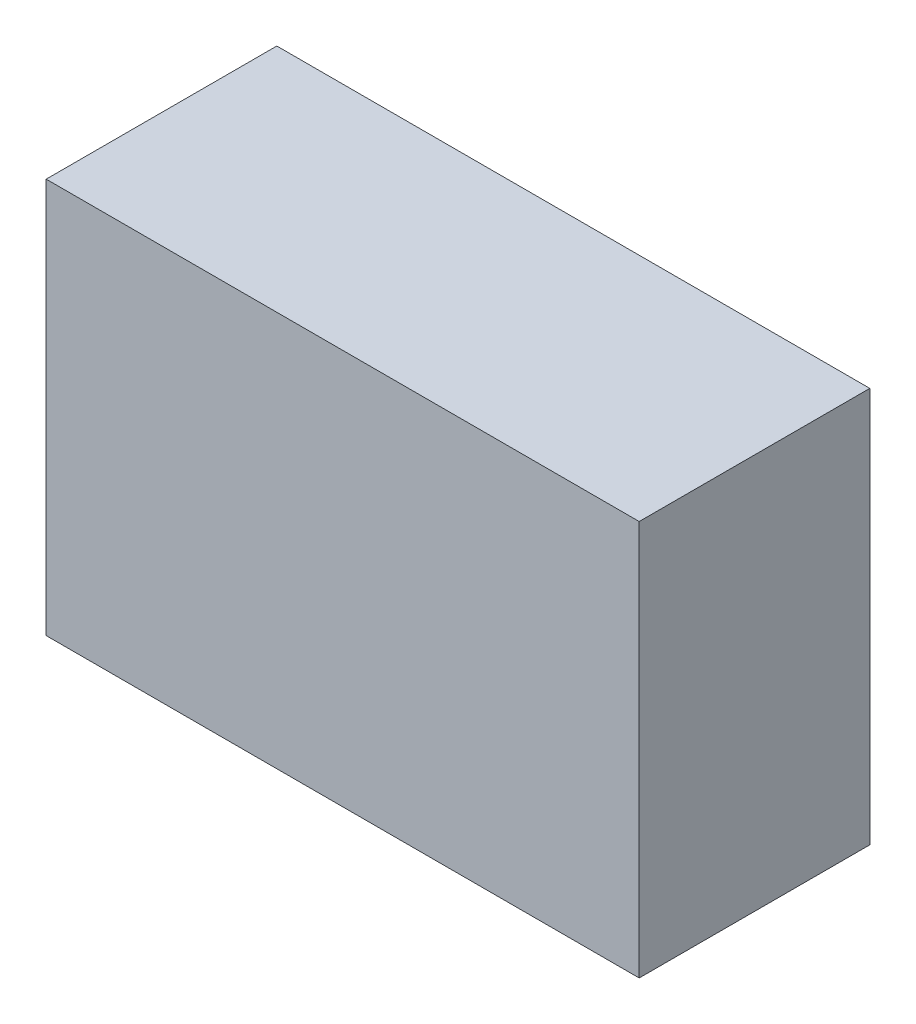
ISO-10303-21;
HEADER;
FILE_DESCRIPTION(('STEP AP214'),'2;1');
FILE_NAME('part.step','',(''),(''),'','','');
FILE_SCHEMA(('AUTOMOTIVE_DESIGN { 1 0 10303 214 1 1 1 1 }'));
ENDSEC;
DATA;
#1=APPLICATION_CONTEXT('core data for automotive mechanical design processes');
#2=APPLICATION_PROTOCOL_DEFINITION('international standard','automotive_design',2000,#1);
#3=PRODUCT_CONTEXT('',#1,'mechanical');
#4=PRODUCT('Part','Part','',(#3));
#5=PRODUCT_RELATED_PRODUCT_CATEGORY('part','',(#4));
#6=PRODUCT_DEFINITION_FORMATION('','',#4);
#7=PRODUCT_DEFINITION_CONTEXT('part definition',#1,'design');
#8=PRODUCT_DEFINITION('design','',#6,#7);
#9=PRODUCT_DEFINITION_SHAPE('','',#8);
#10=(LENGTH_UNIT() NAMED_UNIT(*) SI_UNIT(.MILLI.,.METRE.));
#11=(NAMED_UNIT(*) PLANE_ANGLE_UNIT() SI_UNIT($,.RADIAN.));
#12=(NAMED_UNIT(*) SI_UNIT($,.STERADIAN.) SOLID_ANGLE_UNIT());
#13=UNCERTAINTY_MEASURE_WITH_UNIT(LENGTH_MEASURE(1.E-05),#10,'distance_accuracy_value','');
#14=(GEOMETRIC_REPRESENTATION_CONTEXT(3) GLOBAL_UNCERTAINTY_ASSIGNED_CONTEXT((#13)) GLOBAL_UNIT_ASSIGNED_CONTEXT((#10,
#11,#12)) REPRESENTATION_CONTEXT('',''));
#15=CARTESIAN_POINT('',(0.,0.,0.));
#16=DIRECTION('',(0.,0.,1.));
#17=DIRECTION('',(1.,0.,0.));
#18=AXIS2_PLACEMENT_3D('',#15,#16,#17);
#19=CARTESIAN_POINT('',(0.,0.,14.));
#20=DIRECTION('',(0.,0.,1.));
#21=DIRECTION('',(1.,0.,0.));
#22=AXIS2_PLACEMENT_3D('',#19,#20,#21);
#23=PLANE('',#22);
#24=DIRECTION('',(-1.,0.,0.));
#25=VECTOR('',#24,1.);
#26=CARTESIAN_POINT('',(0.,-12.,14.));
#27=LINE('',#26,#25);
#28=CARTESIAN_POINT('',(18.,-12.,14.));
#29=VERTEX_POINT('',#28);
#30=CARTESIAN_POINT('',(-18.,-12.,14.));
#31=VERTEX_POINT('',#30);
#32=EDGE_CURVE('E11',#29,#31,#27,.T.);
#33=ORIENTED_EDGE('',*,*,#32,.F.);
#34=DIRECTION('',(0.,-1.,0.));
#35=VECTOR('',#34,1.);
#36=CARTESIAN_POINT('',(18.,0.,14.));
#37=LINE('',#36,#35);
#38=CARTESIAN_POINT('',(18.,12.,14.));
#39=VERTEX_POINT('',#38);
#40=EDGE_CURVE('E61',#39,#29,#37,.T.);
#41=ORIENTED_EDGE('',*,*,#40,.F.);
#42=DIRECTION('',(1.,0.,0.));
#43=VECTOR('',#42,1.);
#44=CARTESIAN_POINT('',(0.,12.,14.));
#45=LINE('',#44,#43);
#46=CARTESIAN_POINT('',(-18.,12.,14.));
#47=VERTEX_POINT('',#46);
#48=EDGE_CURVE('E87',#47,#39,#45,.T.);
#49=ORIENTED_EDGE('',*,*,#48,.F.);
#50=DIRECTION('',(0.,1.,0.));
#51=VECTOR('',#50,1.);
#52=CARTESIAN_POINT('',(-18.,0.,14.));
#53=LINE('',#52,#51);
#54=EDGE_CURVE('E24',#31,#47,#53,.T.);
#55=ORIENTED_EDGE('',*,*,#54,.F.);
#56=EDGE_LOOP('',(#33,#41,#49,#55));
#57=FACE_BOUND('',#56,.T.);
#58=ADVANCED_FACE('F17',(#57),#23,.T.);
#59=CARTESIAN_POINT('',(0.,-12.,0.));
#60=DIRECTION('',(0.,-1.,0.));
#61=DIRECTION('',(0.,0.,-1.));
#62=AXIS2_PLACEMENT_3D('',#59,#60,#61);
#63=PLANE('',#62);
#64=DIRECTION('',(0.,0.,1.));
#65=VECTOR('',#64,1.);
#66=CARTESIAN_POINT('',(18.,-12.,0.));
#67=LINE('',#66,#65);
#68=CARTESIAN_POINT('',(18.,-12.,0.));
#69=VERTEX_POINT('',#68);
#70=EDGE_CURVE('E53',#69,#29,#67,.T.);
#71=ORIENTED_EDGE('',*,*,#70,.T.);
#72=ORIENTED_EDGE('',*,*,#32,.T.);
#73=DIRECTION('',(0.,0.,1.));
#74=VECTOR('',#73,1.);
#75=CARTESIAN_POINT('',(-18.,-12.,0.));
#76=LINE('',#75,#74);
#77=CARTESIAN_POINT('',(-18.,-12.,0.));
#78=VERTEX_POINT('',#77);
#79=EDGE_CURVE('E70',#78,#31,#76,.T.);
#80=ORIENTED_EDGE('',*,*,#79,.F.);
#81=DIRECTION('',(1.,0.,0.));
#82=VECTOR('',#81,1.);
#83=CARTESIAN_POINT('',(0.,-12.,0.));
#84=LINE('',#83,#82);
#85=EDGE_CURVE('E65',#78,#69,#84,.T.);
#86=ORIENTED_EDGE('',*,*,#85,.T.);
#87=EDGE_LOOP('',(#71,#72,#80,#86));
#88=FACE_BOUND('',#87,.T.);
#89=ADVANCED_FACE('F66',(#88),#63,.T.);
#90=CARTESIAN_POINT('',(-18.,0.,0.));
#91=DIRECTION('',(-1.,0.,0.));
#92=DIRECTION('',(0.,0.,1.));
#93=AXIS2_PLACEMENT_3D('',#90,#91,#92);
#94=PLANE('',#93);
#95=ORIENTED_EDGE('',*,*,#79,.T.);
#96=ORIENTED_EDGE('',*,*,#54,.T.);
#97=DIRECTION('',(0.,0.,1.));
#98=VECTOR('',#97,1.);
#99=CARTESIAN_POINT('',(-18.,12.,0.));
#100=LINE('',#99,#98);
#101=CARTESIAN_POINT('',(-18.,12.,0.));
#102=VERTEX_POINT('',#101);
#103=EDGE_CURVE('E85',#102,#47,#100,.T.);
#104=ORIENTED_EDGE('',*,*,#103,.F.);
#105=DIRECTION('',(0.,-1.,0.));
#106=VECTOR('',#105,1.);
#107=CARTESIAN_POINT('',(-18.,0.,0.));
#108=LINE('',#107,#106);
#109=EDGE_CURVE('E75',#102,#78,#108,.T.);
#110=ORIENTED_EDGE('',*,*,#109,.T.);
#111=EDGE_LOOP('',(#95,#96,#104,#110));
#112=FACE_BOUND('',#111,.T.);
#113=ADVANCED_FACE('F93',(#112),#94,.T.);
#114=CARTESIAN_POINT('',(0.,12.,0.));
#115=DIRECTION('',(0.,1.,0.));
#116=DIRECTION('',(0.,0.,1.));
#117=AXIS2_PLACEMENT_3D('',#114,#115,#116);
#118=PLANE('',#117);
#119=ORIENTED_EDGE('',*,*,#103,.T.);
#120=ORIENTED_EDGE('',*,*,#48,.T.);
#121=DIRECTION('',(0.,0.,1.));
#122=VECTOR('',#121,1.);
#123=CARTESIAN_POINT('',(18.,12.,0.));
#124=LINE('',#123,#122);
#125=CARTESIAN_POINT('',(18.,12.,0.));
#126=VERTEX_POINT('',#125);
#127=EDGE_CURVE('E62',#126,#39,#124,.T.);
#128=ORIENTED_EDGE('',*,*,#127,.F.);
#129=DIRECTION('',(-1.,0.,0.));
#130=VECTOR('',#129,1.);
#131=CARTESIAN_POINT('',(0.,12.,0.));
#132=LINE('',#131,#130);
#133=EDGE_CURVE('E76',#126,#102,#132,.T.);
#134=ORIENTED_EDGE('',*,*,#133,.T.);
#135=EDGE_LOOP('',(#119,#120,#128,#134));
#136=FACE_BOUND('',#135,.T.);
#137=ADVANCED_FACE('F90',(#136),#118,.T.);
#138=CARTESIAN_POINT('',(0.,0.,0.));
#139=DIRECTION('',(0.,0.,-1.));
#140=DIRECTION('',(-1.,0.,0.));
#141=AXIS2_PLACEMENT_3D('',#138,#139,#140);
#142=PLANE('',#141);
#143=DIRECTION('',(0.,1.,0.));
#144=VECTOR('',#143,1.);
#145=CARTESIAN_POINT('',(18.,0.,0.));
#146=LINE('',#145,#144);
#147=EDGE_CURVE('E56',#69,#126,#146,.T.);
#148=ORIENTED_EDGE('',*,*,#147,.F.);
#149=ORIENTED_EDGE('',*,*,#85,.F.);
#150=ORIENTED_EDGE('',*,*,#109,.F.);
#151=ORIENTED_EDGE('',*,*,#133,.F.);
#152=EDGE_LOOP('',(#148,#149,#150,#151));
#153=FACE_BOUND('',#152,.T.);
#154=ADVANCED_FACE('F72',(#153),#142,.T.);
#155=CARTESIAN_POINT('',(18.,0.,0.));
#156=DIRECTION('',(1.,0.,0.));
#157=DIRECTION('',(0.,0.,-1.));
#158=AXIS2_PLACEMENT_3D('',#155,#156,#157);
#159=PLANE('',#158);
#160=ORIENTED_EDGE('',*,*,#147,.T.);
#161=ORIENTED_EDGE('',*,*,#127,.T.);
#162=ORIENTED_EDGE('',*,*,#40,.T.);
#163=ORIENTED_EDGE('',*,*,#70,.F.);
#164=EDGE_LOOP('',(#160,#161,#162,#163));
#165=FACE_BOUND('',#164,.T.);
#166=ADVANCED_FACE('F57',(#165),#159,.T.);
#167=CLOSED_SHELL('',(#58,#89,#113,#137,#154,#166));
#168=MANIFOLD_SOLID_BREP('B1',#167);
#169=ADVANCED_BREP_SHAPE_REPRESENTATION('',(#18,#168),#14);
#170=SHAPE_DEFINITION_REPRESENTATION(#9,#169);
ENDSEC;
END-ISO-10303-21;
